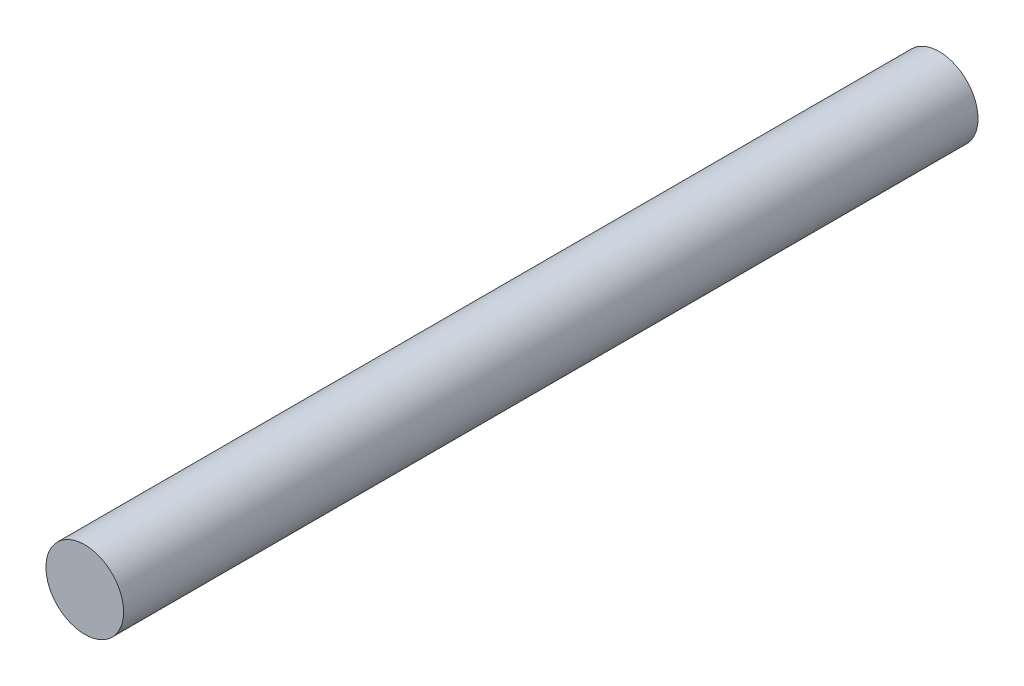
ISO-10303-21;
HEADER;
FILE_DESCRIPTION(('STEP AP214'),'2;1');
FILE_NAME('part.step','',(''),(''),'','','');
FILE_SCHEMA(('AUTOMOTIVE_DESIGN { 1 0 10303 214 1 1 1 1 }'));
ENDSEC;
DATA;
#1=APPLICATION_CONTEXT('core data for automotive mechanical design processes');
#2=APPLICATION_PROTOCOL_DEFINITION('international standard','automotive_design',2000,#1);
#3=PRODUCT_CONTEXT('',#1,'mechanical');
#4=PRODUCT('Part','Part','',(#3));
#5=PRODUCT_RELATED_PRODUCT_CATEGORY('part','',(#4));
#6=PRODUCT_DEFINITION_FORMATION('','',#4);
#7=PRODUCT_DEFINITION_CONTEXT('part definition',#1,'design');
#8=PRODUCT_DEFINITION('design','',#6,#7);
#9=PRODUCT_DEFINITION_SHAPE('','',#8);
#10=(LENGTH_UNIT() NAMED_UNIT(*) SI_UNIT(.MILLI.,.METRE.));
#11=(NAMED_UNIT(*) PLANE_ANGLE_UNIT() SI_UNIT($,.RADIAN.));
#12=(NAMED_UNIT(*) SI_UNIT($,.STERADIAN.) SOLID_ANGLE_UNIT());
#13=UNCERTAINTY_MEASURE_WITH_UNIT(LENGTH_MEASURE(1.E-05),#10,'distance_accuracy_value','');
#14=(GEOMETRIC_REPRESENTATION_CONTEXT(3) GLOBAL_UNCERTAINTY_ASSIGNED_CONTEXT((#13)) GLOBAL_UNIT_ASSIGNED_CONTEXT((#10,
#11,#12)) REPRESENTATION_CONTEXT('',''));
#15=CARTESIAN_POINT('',(0.,0.,0.));
#16=DIRECTION('',(0.,0.,1.));
#17=DIRECTION('',(1.,0.,0.));
#18=AXIS2_PLACEMENT_3D('',#15,#16,#17);
#19=CARTESIAN_POINT('',(0.,0.,-11.));
#20=DIRECTION('',(0.,0.,1.));
#21=DIRECTION('',(1.,0.,0.));
#22=AXIS2_PLACEMENT_3D('',#19,#20,#21);
#23=CYLINDRICAL_SURFACE('',#22,1.);
#24=CARTESIAN_POINT('',(0.,0.,-11.));
#25=DIRECTION('',(0.,0.,1.));
#26=DIRECTION('',(1.,0.,0.));
#27=AXIS2_PLACEMENT_3D('',#24,#25,#26);
#28=CIRCLE('',#27,1.);
#29=CARTESIAN_POINT('',(1.,0.,-11.));
#30=VERTEX_POINT('',#29);
#31=EDGE_CURVE('E10',#30,#30,#28,.T.);
#32=ORIENTED_EDGE('',*,*,#31,.T.);
#33=EDGE_LOOP('',(#32));
#34=FACE_BOUND('',#33,.T.);
#35=CARTESIAN_POINT('',(0.,0.,11.));
#36=DIRECTION('',(0.,0.,1.));
#37=DIRECTION('',(1.,0.,0.));
#38=AXIS2_PLACEMENT_3D('',#35,#36,#37);
#39=CIRCLE('',#38,1.);
#40=CARTESIAN_POINT('',(1.,0.,11.));
#41=VERTEX_POINT('',#40);
#42=EDGE_CURVE('E41',#41,#41,#39,.T.);
#43=ORIENTED_EDGE('',*,*,#42,.F.);
#44=EDGE_LOOP('',(#43));
#45=FACE_BOUND('',#44,.T.);
#46=ADVANCED_FACE('F34',(#34,#45),#23,.T.);
#47=CARTESIAN_POINT('',(0.,0.,-11.));
#48=DIRECTION('',(0.,0.,1.));
#49=DIRECTION('',(1.,0.,0.));
#50=AXIS2_PLACEMENT_3D('',#47,#48,#49);
#51=PLANE('',#50);
#52=ORIENTED_EDGE('',*,*,#31,.F.);
#53=EDGE_LOOP('',(#52));
#54=FACE_BOUND('',#53,.T.);
#55=ADVANCED_FACE('F49',(#54),#51,.F.);
#56=CARTESIAN_POINT('',(0.,0.,11.));
#57=DIRECTION('',(0.,0.,1.));
#58=DIRECTION('',(1.,0.,0.));
#59=AXIS2_PLACEMENT_3D('',#56,#57,#58);
#60=PLANE('',#59);
#61=ORIENTED_EDGE('',*,*,#42,.T.);
#62=EDGE_LOOP('',(#61));
#63=FACE_BOUND('',#62,.T.);
#64=ADVANCED_FACE('F50',(#63),#60,.T.);
#65=CLOSED_SHELL('',(#46,#55,#64));
#66=MANIFOLD_SOLID_BREP('B2',#65);
#67=ADVANCED_BREP_SHAPE_REPRESENTATION('',(#18,#66),#14);
#68=SHAPE_DEFINITION_REPRESENTATION(#9,#67);
ENDSEC;
END-ISO-10303-21;
